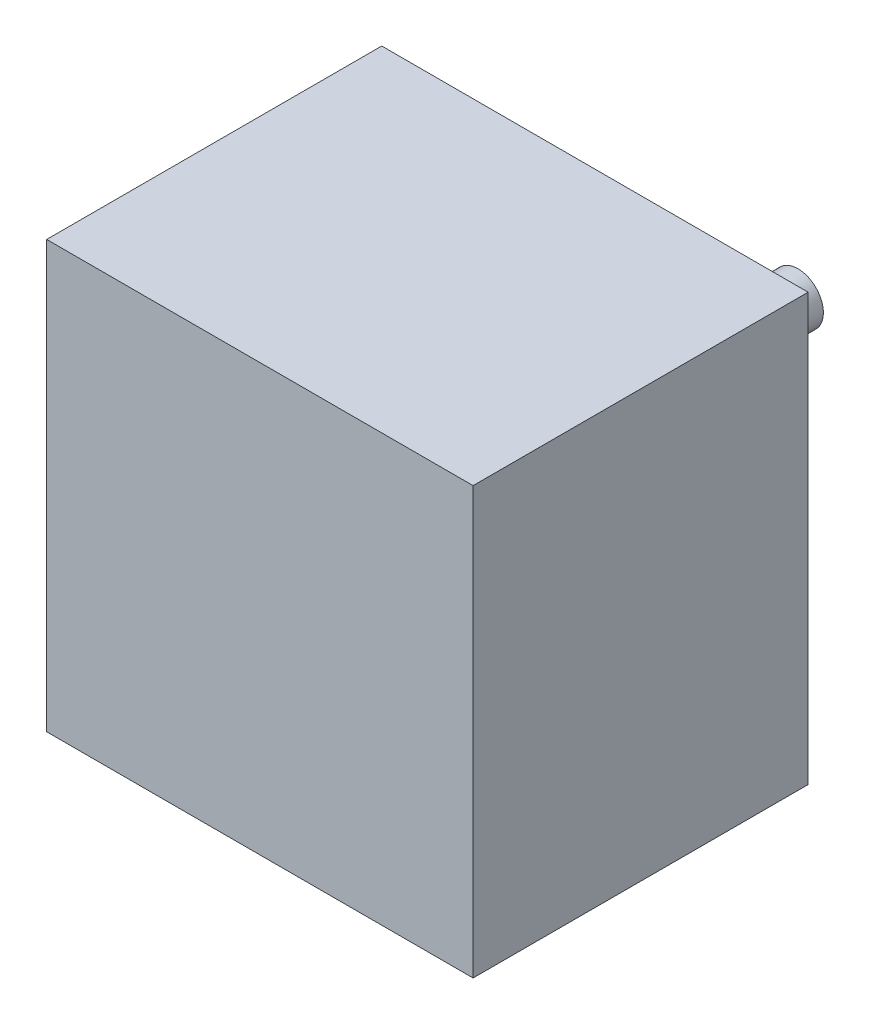
ISO-10303-21;
HEADER;
FILE_DESCRIPTION(('STEP AP214'),'2;1');
FILE_NAME('part.step','',(''),(''),'','','');
FILE_SCHEMA(('AUTOMOTIVE_DESIGN { 1 0 10303 214 1 1 1 1 }'));
ENDSEC;
DATA;
#1=APPLICATION_CONTEXT('core data for automotive mechanical design processes');
#2=APPLICATION_PROTOCOL_DEFINITION('international standard','automotive_design',2000,#1);
#3=PRODUCT_CONTEXT('',#1,'mechanical');
#4=PRODUCT('Part','Part','',(#3));
#5=PRODUCT_RELATED_PRODUCT_CATEGORY('part','',(#4));
#6=PRODUCT_DEFINITION_FORMATION('','',#4);
#7=PRODUCT_DEFINITION_CONTEXT('part definition',#1,'design');
#8=PRODUCT_DEFINITION('design','',#6,#7);
#9=PRODUCT_DEFINITION_SHAPE('','',#8);
#10=(LENGTH_UNIT() NAMED_UNIT(*) SI_UNIT(.MILLI.,.METRE.));
#11=(NAMED_UNIT(*) PLANE_ANGLE_UNIT() SI_UNIT($,.RADIAN.));
#12=(NAMED_UNIT(*) SI_UNIT($,.STERADIAN.) SOLID_ANGLE_UNIT());
#13=UNCERTAINTY_MEASURE_WITH_UNIT(LENGTH_MEASURE(1.E-05),#10,'distance_accuracy_value','');
#14=(GEOMETRIC_REPRESENTATION_CONTEXT(3) GLOBAL_UNCERTAINTY_ASSIGNED_CONTEXT((#13)) GLOBAL_UNIT_ASSIGNED_CONTEXT((#10,
#11,#12)) REPRESENTATION_CONTEXT('',''));
#15=CARTESIAN_POINT('',(0.,0.,0.));
#16=DIRECTION('',(0.,0.,1.));
#17=DIRECTION('',(1.,0.,0.));
#18=AXIS2_PLACEMENT_3D('',#15,#16,#17);
#19=CARTESIAN_POINT('',(0.,0.,33.));
#20=DIRECTION('',(-1.,0.,0.));
#21=DIRECTION('',(0.,0.,1.));
#22=AXIS2_PLACEMENT_3D('',#19,#20,#21);
#23=PLANE('',#22);
#24=DIRECTION('',(0.,1.,0.));
#25=VECTOR('',#24,1.);
#26=CARTESIAN_POINT('',(0.,0.,0.));
#27=LINE('',#26,#25);
#28=CARTESIAN_POINT('',(0.,0.,0.));
#29=VERTEX_POINT('',#28);
#30=CARTESIAN_POINT('',(0.,42.,0.));
#31=VERTEX_POINT('',#30);
#32=EDGE_CURVE('E99',#29,#31,#27,.T.);
#33=ORIENTED_EDGE('',*,*,#32,.T.);
#34=DIRECTION('',(0.,0.,-1.));
#35=VECTOR('',#34,1.);
#36=CARTESIAN_POINT('',(0.,42.,33.));
#37=LINE('',#36,#35);
#38=CARTESIAN_POINT('',(0.,42.,33.));
#39=VERTEX_POINT('',#38);
#40=EDGE_CURVE('E35',#39,#31,#37,.T.);
#41=ORIENTED_EDGE('',*,*,#40,.F.);
#42=DIRECTION('',(0.,1.,0.));
#43=VECTOR('',#42,1.);
#44=CARTESIAN_POINT('',(0.,0.,33.));
#45=LINE('',#44,#43);
#46=CARTESIAN_POINT('',(0.,0.,33.));
#47=VERTEX_POINT('',#46);
#48=EDGE_CURVE('E86',#47,#39,#45,.T.);
#49=ORIENTED_EDGE('',*,*,#48,.F.);
#50=DIRECTION('',(0.,0.,-1.));
#51=VECTOR('',#50,1.);
#52=CARTESIAN_POINT('',(0.,0.,33.));
#53=LINE('',#52,#51);
#54=EDGE_CURVE('E95',#47,#29,#53,.T.);
#55=ORIENTED_EDGE('',*,*,#54,.T.);
#56=EDGE_LOOP('',(#33,#41,#49,#55));
#57=FACE_BOUND('',#56,.T.);
#58=ADVANCED_FACE('F32',(#57),#23,.F.);
#59=CARTESIAN_POINT('',(0.,42.,33.));
#60=DIRECTION('',(0.,-1.,0.));
#61=DIRECTION('',(1.,0.,0.));
#62=AXIS2_PLACEMENT_3D('',#59,#60,#61);
#63=PLANE('',#62);
#64=DIRECTION('',(-1.,0.,0.));
#65=VECTOR('',#64,1.);
#66=CARTESIAN_POINT('',(0.,42.,0.));
#67=LINE('',#66,#65);
#68=CARTESIAN_POINT('',(-42.,42.,0.));
#69=VERTEX_POINT('',#68);
#70=EDGE_CURVE('E91',#31,#69,#67,.T.);
#71=ORIENTED_EDGE('',*,*,#70,.T.);
#72=DIRECTION('',(0.,0.,-1.));
#73=VECTOR('',#72,1.);
#74=CARTESIAN_POINT('',(-42.,42.,33.));
#75=LINE('',#74,#73);
#76=CARTESIAN_POINT('',(-42.,42.,33.));
#77=VERTEX_POINT('',#76);
#78=EDGE_CURVE('E89',#77,#69,#75,.T.);
#79=ORIENTED_EDGE('',*,*,#78,.F.);
#80=DIRECTION('',(-1.,0.,0.));
#81=VECTOR('',#80,1.);
#82=CARTESIAN_POINT('',(0.,42.,33.));
#83=LINE('',#82,#81);
#84=EDGE_CURVE('E81',#39,#77,#83,.T.);
#85=ORIENTED_EDGE('',*,*,#84,.F.);
#86=ORIENTED_EDGE('',*,*,#40,.T.);
#87=EDGE_LOOP('',(#71,#79,#85,#86));
#88=FACE_BOUND('',#87,.T.);
#89=ADVANCED_FACE('F90',(#88),#63,.F.);
#90=CARTESIAN_POINT('',(-42.,0.,33.));
#91=DIRECTION('',(1.,0.,0.));
#92=DIRECTION('',(0.,0.,-1.));
#93=AXIS2_PLACEMENT_3D('',#90,#91,#92);
#94=PLANE('',#93);
#95=DIRECTION('',(0.,-1.,0.));
#96=VECTOR('',#95,1.);
#97=CARTESIAN_POINT('',(-42.,0.,0.));
#98=LINE('',#97,#96);
#99=CARTESIAN_POINT('',(-42.,0.,0.));
#100=VERTEX_POINT('',#99);
#101=EDGE_CURVE('E67',#69,#100,#98,.T.);
#102=ORIENTED_EDGE('',*,*,#101,.T.);
#103=DIRECTION('',(0.,0.,-1.));
#104=VECTOR('',#103,1.);
#105=CARTESIAN_POINT('',(-42.,0.,33.));
#106=LINE('',#105,#104);
#107=CARTESIAN_POINT('',(-42.,0.,33.));
#108=VERTEX_POINT('',#107);
#109=EDGE_CURVE('E92',#108,#100,#106,.T.);
#110=ORIENTED_EDGE('',*,*,#109,.F.);
#111=DIRECTION('',(0.,-1.,0.));
#112=VECTOR('',#111,1.);
#113=CARTESIAN_POINT('',(-42.,0.,33.));
#114=LINE('',#113,#112);
#115=EDGE_CURVE('E84',#77,#108,#114,.T.);
#116=ORIENTED_EDGE('',*,*,#115,.F.);
#117=ORIENTED_EDGE('',*,*,#78,.T.);
#118=EDGE_LOOP('',(#102,#110,#116,#117));
#119=FACE_BOUND('',#118,.T.);
#120=ADVANCED_FACE('F93',(#119),#94,.F.);
#121=CARTESIAN_POINT('',(0.,0.,33.));
#122=DIRECTION('',(0.,1.,0.));
#123=DIRECTION('',(-1.,0.,0.));
#124=AXIS2_PLACEMENT_3D('',#121,#122,#123);
#125=PLANE('',#124);
#126=DIRECTION('',(1.,0.,0.));
#127=VECTOR('',#126,1.);
#128=CARTESIAN_POINT('',(0.,0.,0.));
#129=LINE('',#128,#127);
#130=EDGE_CURVE('E73',#100,#29,#129,.T.);
#131=ORIENTED_EDGE('',*,*,#130,.T.);
#132=ORIENTED_EDGE('',*,*,#54,.F.);
#133=DIRECTION('',(1.,0.,0.));
#134=VECTOR('',#133,1.);
#135=CARTESIAN_POINT('',(0.,0.,33.));
#136=LINE('',#135,#134);
#137=EDGE_CURVE('E50',#108,#47,#136,.T.);
#138=ORIENTED_EDGE('',*,*,#137,.F.);
#139=ORIENTED_EDGE('',*,*,#109,.T.);
#140=EDGE_LOOP('',(#131,#132,#138,#139));
#141=FACE_BOUND('',#140,.T.);
#142=ADVANCED_FACE('F107',(#141),#125,.F.);
#143=CARTESIAN_POINT('',(0.,0.,33.));
#144=DIRECTION('',(0.,0.,1.));
#145=DIRECTION('',(1.,0.,0.));
#146=AXIS2_PLACEMENT_3D('',#143,#144,#145);
#147=PLANE('',#146);
#148=ORIENTED_EDGE('',*,*,#48,.T.);
#149=ORIENTED_EDGE('',*,*,#84,.T.);
#150=ORIENTED_EDGE('',*,*,#115,.T.);
#151=ORIENTED_EDGE('',*,*,#137,.T.);
#152=EDGE_LOOP('',(#148,#149,#150,#151));
#153=FACE_BOUND('',#152,.T.);
#154=ADVANCED_FACE('F82',(#153),#147,.T.);
#155=CARTESIAN_POINT('',(0.,0.,0.));
#156=DIRECTION('',(0.,0.,1.));
#157=DIRECTION('',(1.,0.,0.));
#158=AXIS2_PLACEMENT_3D('',#155,#156,#157);
#159=PLANE('',#158);
#160=CARTESIAN_POINT('',(-5.5,36.5,0.));
#161=DIRECTION('',(0.,0.,-1.));
#162=DIRECTION('',(-1.,0.,0.));
#163=AXIS2_PLACEMENT_3D('',#160,#161,#162);
#164=CIRCLE('',#163,1.5);
#165=CARTESIAN_POINT('',(-7.,36.5,0.));
#166=VERTEX_POINT('',#165);
#167=EDGE_CURVE('E127',#166,#166,#164,.T.);
#168=ORIENTED_EDGE('',*,*,#167,.F.);
#169=EDGE_LOOP('',(#168));
#170=FACE_BOUND('',#169,.T.);
#171=CARTESIAN_POINT('',(-36.5,36.5,0.));
#172=DIRECTION('',(0.,0.,-1.));
#173=DIRECTION('',(-1.,0.,0.));
#174=AXIS2_PLACEMENT_3D('',#171,#172,#173);
#175=CIRCLE('',#174,1.5);
#176=CARTESIAN_POINT('',(-38.,36.5,0.));
#177=VERTEX_POINT('',#176);
#178=EDGE_CURVE('E133',#177,#177,#175,.T.);
#179=ORIENTED_EDGE('',*,*,#178,.F.);
#180=EDGE_LOOP('',(#179));
#181=FACE_BOUND('',#180,.T.);
#182=CARTESIAN_POINT('',(-36.5,5.5,0.));
#183=DIRECTION('',(0.,0.,-1.));
#184=DIRECTION('',(-1.,0.,0.));
#185=AXIS2_PLACEMENT_3D('',#182,#183,#184);
#186=CIRCLE('',#185,1.5);
#187=CARTESIAN_POINT('',(-38.,5.5,0.));
#188=VERTEX_POINT('',#187);
#189=EDGE_CURVE('E139',#188,#188,#186,.T.);
#190=ORIENTED_EDGE('',*,*,#189,.F.);
#191=EDGE_LOOP('',(#190));
#192=FACE_BOUND('',#191,.T.);
#193=CARTESIAN_POINT('',(-5.5,5.5,0.));
#194=DIRECTION('',(0.,0.,-1.));
#195=DIRECTION('',(-1.,0.,0.));
#196=AXIS2_PLACEMENT_3D('',#193,#194,#195);
#197=CIRCLE('',#196,1.5);
#198=CARTESIAN_POINT('',(-7.,5.5,0.));
#199=VERTEX_POINT('',#198);
#200=EDGE_CURVE('E121',#199,#199,#197,.T.);
#201=ORIENTED_EDGE('',*,*,#200,.F.);
#202=EDGE_LOOP('',(#201));
#203=FACE_BOUND('',#202,.T.);
#204=CARTESIAN_POINT('',(-21.,21.,0.));
#205=DIRECTION('',(0.,0.,-1.));
#206=DIRECTION('',(-1.,0.,0.));
#207=AXIS2_PLACEMENT_3D('',#204,#205,#206);
#208=CIRCLE('',#207,11.);
#209=CARTESIAN_POINT('',(-32.,21.,0.));
#210=VERTEX_POINT('',#209);
#211=EDGE_CURVE('E41',#210,#210,#208,.T.);
#212=ORIENTED_EDGE('',*,*,#211,.F.);
#213=EDGE_LOOP('',(#212));
#214=FACE_BOUND('',#213,.T.);
#215=ORIENTED_EDGE('',*,*,#32,.F.);
#216=ORIENTED_EDGE('',*,*,#130,.F.);
#217=ORIENTED_EDGE('',*,*,#101,.F.);
#218=ORIENTED_EDGE('',*,*,#70,.F.);
#219=EDGE_LOOP('',(#215,#216,#217,#218));
#220=FACE_BOUND('',#219,.T.);
#221=ADVANCED_FACE('F110',(#170,#181,#192,#203,#214,#220),#159,.F.);
#222=CARTESIAN_POINT('',(-21.,21.,-2.));
#223=DIRECTION('',(0.,0.,1.));
#224=DIRECTION('',(1.,0.,0.));
#225=AXIS2_PLACEMENT_3D('',#222,#223,#224);
#226=CYLINDRICAL_SURFACE('',#225,11.);
#227=CARTESIAN_POINT('',(-21.,21.,-2.));
#228=DIRECTION('',(0.,0.,-1.));
#229=DIRECTION('',(-1.,0.,0.));
#230=AXIS2_PLACEMENT_3D('',#227,#228,#229);
#231=CIRCLE('',#230,11.);
#232=CARTESIAN_POINT('',(-32.,21.,-2.));
#233=VERTEX_POINT('',#232);
#234=EDGE_CURVE('E102',#233,#233,#231,.T.);
#235=ORIENTED_EDGE('',*,*,#234,.F.);
#236=EDGE_LOOP('',(#235));
#237=FACE_BOUND('',#236,.T.);
#238=ORIENTED_EDGE('',*,*,#211,.T.);
#239=EDGE_LOOP('',(#238));
#240=FACE_BOUND('',#239,.T.);
#241=ADVANCED_FACE('F156',(#237,#240),#226,.T.);
#242=CARTESIAN_POINT('',(-21.,21.,-2.));
#243=DIRECTION('',(0.,0.,-1.));
#244=DIRECTION('',(-1.,0.,0.));
#245=AXIS2_PLACEMENT_3D('',#242,#243,#244);
#246=PLANE('',#245);
#247=CARTESIAN_POINT('',(-21.,21.,-2.));
#248=DIRECTION('',(0.,0.,-1.));
#249=DIRECTION('',(-1.,0.,0.));
#250=AXIS2_PLACEMENT_3D('',#247,#248,#249);
#251=CIRCLE('',#250,2.5);
#252=CARTESIAN_POINT('',(-23.5,21.,-2.));
#253=VERTEX_POINT('',#252);
#254=EDGE_CURVE('E11',#253,#253,#251,.T.);
#255=ORIENTED_EDGE('',*,*,#254,.F.);
#256=EDGE_LOOP('',(#255));
#257=FACE_BOUND('',#256,.T.);
#258=ORIENTED_EDGE('',*,*,#234,.T.);
#259=EDGE_LOOP('',(#258));
#260=FACE_BOUND('',#259,.T.);
#261=ADVANCED_FACE('F164',(#257,#260),#246,.T.);
#262=CARTESIAN_POINT('',(-21.,21.,-20.));
#263=DIRECTION('',(0.,0.,1.));
#264=DIRECTION('',(1.,0.,0.));
#265=AXIS2_PLACEMENT_3D('',#262,#263,#264);
#266=CYLINDRICAL_SURFACE('',#265,2.5);
#267=CARTESIAN_POINT('',(-21.,21.,-20.));
#268=DIRECTION('',(0.,0.,-1.));
#269=DIRECTION('',(-1.,0.,0.));
#270=AXIS2_PLACEMENT_3D('',#267,#268,#269);
#271=CIRCLE('',#270,2.5);
#272=CARTESIAN_POINT('',(-23.5,21.,-20.));
#273=VERTEX_POINT('',#272);
#274=EDGE_CURVE('E116',#273,#273,#271,.T.);
#275=ORIENTED_EDGE('',*,*,#274,.F.);
#276=EDGE_LOOP('',(#275));
#277=FACE_BOUND('',#276,.T.);
#278=ORIENTED_EDGE('',*,*,#254,.T.);
#279=EDGE_LOOP('',(#278));
#280=FACE_BOUND('',#279,.T.);
#281=ADVANCED_FACE('F170',(#277,#280),#266,.T.);
#282=CARTESIAN_POINT('',(-21.,21.,-20.));
#283=DIRECTION('',(0.,0.,-1.));
#284=DIRECTION('',(-1.,0.,0.));
#285=AXIS2_PLACEMENT_3D('',#282,#283,#284);
#286=PLANE('',#285);
#287=ORIENTED_EDGE('',*,*,#274,.T.);
#288=EDGE_LOOP('',(#287));
#289=FACE_BOUND('',#288,.T.);
#290=ADVANCED_FACE('F201',(#289),#286,.T.);
#291=CARTESIAN_POINT('',(-5.5,5.5,8.));
#292=DIRECTION('',(0.,0.,-1.));
#293=DIRECTION('',(-1.,0.,0.));
#294=AXIS2_PLACEMENT_3D('',#291,#292,#293);
#295=CYLINDRICAL_SURFACE('',#294,1.5);
#296=CARTESIAN_POINT('',(-5.5,5.5,8.));
#297=DIRECTION('',(0.,0.,-1.));
#298=DIRECTION('',(-1.,0.,0.));
#299=AXIS2_PLACEMENT_3D('',#296,#297,#298);
#300=CIRCLE('',#299,1.5);
#301=CARTESIAN_POINT('',(-7.,5.5,8.));
#302=VERTEX_POINT('',#301);
#303=EDGE_CURVE('E120',#302,#302,#300,.T.);
#304=ORIENTED_EDGE('',*,*,#303,.F.);
#305=EDGE_LOOP('',(#304));
#306=FACE_BOUND('',#305,.T.);
#307=ORIENTED_EDGE('',*,*,#200,.T.);
#308=EDGE_LOOP('',(#307));
#309=FACE_BOUND('',#308,.T.);
#310=ADVANCED_FACE('F206',(#306,#309),#295,.F.);
#311=CARTESIAN_POINT('',(-5.5,5.5,8.));
#312=DIRECTION('',(0.,0.,-1.));
#313=DIRECTION('',(-1.,0.,0.));
#314=AXIS2_PLACEMENT_3D('',#311,#312,#313);
#315=PLANE('',#314);
#316=ORIENTED_EDGE('',*,*,#303,.T.);
#317=EDGE_LOOP('',(#316));
#318=FACE_BOUND('',#317,.T.);
#319=ADVANCED_FACE('F150',(#318),#315,.T.);
#320=CARTESIAN_POINT('',(-36.5,5.5,8.));
#321=DIRECTION('',(0.,0.,-1.));
#322=DIRECTION('',(-1.,0.,0.));
#323=AXIS2_PLACEMENT_3D('',#320,#321,#322);
#324=CYLINDRICAL_SURFACE('',#323,1.5);
#325=CARTESIAN_POINT('',(-36.5,5.5,8.));
#326=DIRECTION('',(0.,0.,-1.));
#327=DIRECTION('',(-1.,0.,0.));
#328=AXIS2_PLACEMENT_3D('',#325,#326,#327);
#329=CIRCLE('',#328,1.5);
#330=CARTESIAN_POINT('',(-38.,5.5,8.));
#331=VERTEX_POINT('',#330);
#332=EDGE_CURVE('E124',#331,#331,#329,.T.);
#333=ORIENTED_EDGE('',*,*,#332,.F.);
#334=EDGE_LOOP('',(#333));
#335=FACE_BOUND('',#334,.T.);
#336=ORIENTED_EDGE('',*,*,#189,.T.);
#337=EDGE_LOOP('',(#336));
#338=FACE_BOUND('',#337,.T.);
#339=ADVANCED_FACE('F147',(#335,#338),#324,.F.);
#340=CARTESIAN_POINT('',(-36.5,5.5,8.));
#341=DIRECTION('',(0.,0.,-1.));
#342=DIRECTION('',(-1.,0.,0.));
#343=AXIS2_PLACEMENT_3D('',#340,#341,#342);
#344=PLANE('',#343);
#345=ORIENTED_EDGE('',*,*,#332,.T.);
#346=EDGE_LOOP('',(#345));
#347=FACE_BOUND('',#346,.T.);
#348=ADVANCED_FACE('F145',(#347),#344,.T.);
#349=CARTESIAN_POINT('',(-36.5,36.5,8.));
#350=DIRECTION('',(0.,0.,-1.));
#351=DIRECTION('',(-1.,0.,0.));
#352=AXIS2_PLACEMENT_3D('',#349,#350,#351);
#353=CYLINDRICAL_SURFACE('',#352,1.5);
#354=CARTESIAN_POINT('',(-36.5,36.5,8.));
#355=DIRECTION('',(0.,0.,-1.));
#356=DIRECTION('',(-1.,0.,0.));
#357=AXIS2_PLACEMENT_3D('',#354,#355,#356);
#358=CIRCLE('',#357,1.5);
#359=CARTESIAN_POINT('',(-38.,36.5,8.));
#360=VERTEX_POINT('',#359);
#361=EDGE_CURVE('E136',#360,#360,#358,.T.);
#362=ORIENTED_EDGE('',*,*,#361,.F.);
#363=EDGE_LOOP('',(#362));
#364=FACE_BOUND('',#363,.T.);
#365=ORIENTED_EDGE('',*,*,#178,.T.);
#366=EDGE_LOOP('',(#365));
#367=FACE_BOUND('',#366,.T.);
#368=ADVANCED_FACE('F235',(#364,#367),#353,.F.);
#369=CARTESIAN_POINT('',(-36.5,36.5,8.));
#370=DIRECTION('',(0.,0.,-1.));
#371=DIRECTION('',(-1.,0.,0.));
#372=AXIS2_PLACEMENT_3D('',#369,#370,#371);
#373=PLANE('',#372);
#374=ORIENTED_EDGE('',*,*,#361,.T.);
#375=EDGE_LOOP('',(#374));
#376=FACE_BOUND('',#375,.T.);
#377=ADVANCED_FACE('F244',(#376),#373,.T.);
#378=CARTESIAN_POINT('',(-5.5,36.5,8.));
#379=DIRECTION('',(0.,0.,-1.));
#380=DIRECTION('',(-1.,0.,0.));
#381=AXIS2_PLACEMENT_3D('',#378,#379,#380);
#382=CYLINDRICAL_SURFACE('',#381,1.5);
#383=CARTESIAN_POINT('',(-5.5,36.5,8.));
#384=DIRECTION('',(0.,0.,-1.));
#385=DIRECTION('',(-1.,0.,0.));
#386=AXIS2_PLACEMENT_3D('',#383,#384,#385);
#387=CIRCLE('',#386,1.5);
#388=CARTESIAN_POINT('',(-7.,36.5,8.));
#389=VERTEX_POINT('',#388);
#390=EDGE_CURVE('E130',#389,#389,#387,.T.);
#391=ORIENTED_EDGE('',*,*,#390,.F.);
#392=EDGE_LOOP('',(#391));
#393=FACE_BOUND('',#392,.T.);
#394=ORIENTED_EDGE('',*,*,#167,.T.);
#395=EDGE_LOOP('',(#394));
#396=FACE_BOUND('',#395,.T.);
#397=ADVANCED_FACE('F254',(#393,#396),#382,.F.);
#398=CARTESIAN_POINT('',(-5.5,36.5,8.));
#399=DIRECTION('',(0.,0.,-1.));
#400=DIRECTION('',(-1.,0.,0.));
#401=AXIS2_PLACEMENT_3D('',#398,#399,#400);
#402=PLANE('',#401);
#403=ORIENTED_EDGE('',*,*,#390,.T.);
#404=EDGE_LOOP('',(#403));
#405=FACE_BOUND('',#404,.T.);
#406=ADVANCED_FACE('F264',(#405),#402,.T.);
#407=CLOSED_SHELL('',(#58,#89,#120,#142,#154,#221,#241,#261,#281,#290,#310,#319,#339,#348,#368,
#377,#397,#406));
#408=MANIFOLD_SOLID_BREP('B2',#407);
#409=ADVANCED_BREP_SHAPE_REPRESENTATION('',(#18,#408),#14);
#410=SHAPE_DEFINITION_REPRESENTATION(#9,#409);
ENDSEC;
END-ISO-10303-21;
